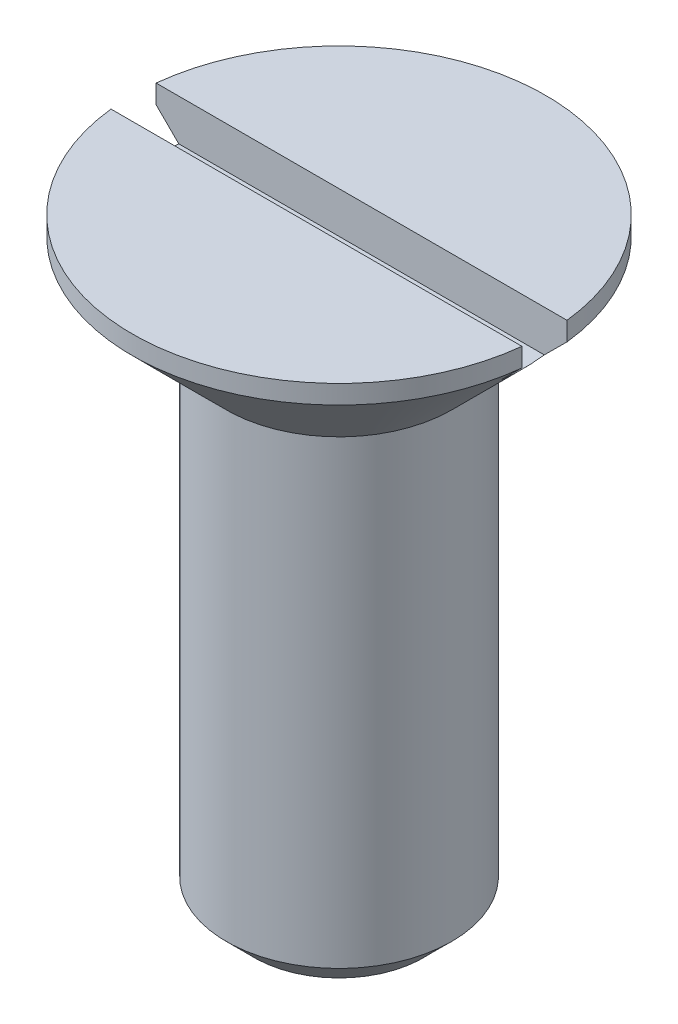
ISO-10303-21;
HEADER;
FILE_DESCRIPTION(('STEP AP214'),'2;1');
FILE_NAME('part.step','',(''),(''),'','','');
FILE_SCHEMA(('AUTOMOTIVE_DESIGN { 1 0 10303 214 1 1 1 1 }'));
ENDSEC;
DATA;
#1=APPLICATION_CONTEXT('core data for automotive mechanical design processes');
#2=APPLICATION_PROTOCOL_DEFINITION('international standard','automotive_design',2000,#1);
#3=PRODUCT_CONTEXT('',#1,'mechanical');
#4=PRODUCT('Part','Part','',(#3));
#5=PRODUCT_RELATED_PRODUCT_CATEGORY('part','',(#4));
#6=PRODUCT_DEFINITION_FORMATION('','',#4);
#7=PRODUCT_DEFINITION_CONTEXT('part definition',#1,'design');
#8=PRODUCT_DEFINITION('design','',#6,#7);
#9=PRODUCT_DEFINITION_SHAPE('','',#8);
#10=(LENGTH_UNIT() NAMED_UNIT(*) SI_UNIT(.MILLI.,.METRE.));
#11=(NAMED_UNIT(*) PLANE_ANGLE_UNIT() SI_UNIT($,.RADIAN.));
#12=(NAMED_UNIT(*) SI_UNIT($,.STERADIAN.) SOLID_ANGLE_UNIT());
#13=UNCERTAINTY_MEASURE_WITH_UNIT(LENGTH_MEASURE(1.E-05),#10,'distance_accuracy_value','');
#14=(GEOMETRIC_REPRESENTATION_CONTEXT(3) GLOBAL_UNCERTAINTY_ASSIGNED_CONTEXT((#13)) GLOBAL_UNIT_ASSIGNED_CONTEXT((#10,
#11,#12)) REPRESENTATION_CONTEXT('',''));
#15=CARTESIAN_POINT('',(0.,0.,0.));
#16=DIRECTION('',(0.,0.,1.));
#17=DIRECTION('',(1.,0.,0.));
#18=AXIS2_PLACEMENT_3D('',#15,#16,#17);
#19=CARTESIAN_POINT('',(0.,125.763182897862,0.));
#20=DIRECTION('',(0.,1.,0.));
#21=DIRECTION('',(-1.,0.,0.));
#22=AXIS2_PLACEMENT_3D('',#19,#20,#21);
#23=CYLINDRICAL_SURFACE('',#22,5.50000000000001);
#24=CARTESIAN_POINT('',(0.,15.5,0.));
#25=DIRECTION('',(0.,1.,0.));
#26=DIRECTION('',(-1.,0.,0.));
#27=AXIS2_PLACEMENT_3D('',#24,#25,#26);
#28=CIRCLE('',#27,5.50000000000001);
#29=CARTESIAN_POINT('',(5.46717477313467,15.5,-0.600000000000001));
#30=VERTEX_POINT('',#29);
#31=CARTESIAN_POINT('',(-5.46717477313467,15.5,-0.599999999999999));
#32=VERTEX_POINT('',#31);
#33=EDGE_CURVE('E101',#30,#32,#28,.T.);
#34=ORIENTED_EDGE('',*,*,#33,.T.);
#35=DIRECTION('',(0.,1.,0.));
#36=VECTOR('',#35,1.);
#37=CARTESIAN_POINT('',(-5.46717477313468,125.763182897862,-0.599999999999999));
#38=LINE('',#37,#36);
#39=CARTESIAN_POINT('',(-5.46717477313467,16.,-0.599999999999999));
#40=VERTEX_POINT('',#39);
#41=EDGE_CURVE('E52',#32,#40,#38,.T.);
#42=ORIENTED_EDGE('',*,*,#41,.T.);
#43=CARTESIAN_POINT('',(0.,16.,0.));
#44=DIRECTION('',(0.,1.,0.));
#45=DIRECTION('',(-1.,0.,0.));
#46=AXIS2_PLACEMENT_3D('',#43,#44,#45);
#47=CIRCLE('',#46,5.50000000000001);
#48=CARTESIAN_POINT('',(5.46717477313467,16.,-0.600000000000001));
#49=VERTEX_POINT('',#48);
#50=EDGE_CURVE('E102',#49,#40,#47,.T.);
#51=ORIENTED_EDGE('',*,*,#50,.F.);
#52=DIRECTION('',(0.,1.,0.));
#53=VECTOR('',#52,1.);
#54=CARTESIAN_POINT('',(5.46717477313466,125.763182897862,-0.600000000000001));
#55=LINE('',#54,#53);
#56=EDGE_CURVE('E138',#49,#30,#55,.F.);
#57=ORIENTED_EDGE('',*,*,#56,.T.);
#58=EDGE_LOOP('',(#34,#42,#51,#57));
#59=FACE_BOUND('',#58,.T.);
#60=ADVANCED_FACE('F29',(#59),#23,.T.);
#61=CARTESIAN_POINT('',(0.,16.,0.));
#62=DIRECTION('',(0.,-1.,0.));
#63=DIRECTION('',(1.,0.,0.));
#64=AXIS2_PLACEMENT_3D('',#61,#62,#63);
#65=PLANE('',#64);
#66=ORIENTED_EDGE('',*,*,#50,.T.);
#67=DIRECTION('',(1.,0.,0.));
#68=VECTOR('',#67,1.);
#69=CARTESIAN_POINT('',(0.,16.,-0.6));
#70=LINE('',#69,#68);
#71=EDGE_CURVE('E88',#40,#49,#70,.T.);
#72=ORIENTED_EDGE('',*,*,#71,.T.);
#73=EDGE_LOOP('',(#66,#72));
#74=FACE_BOUND('',#73,.T.);
#75=ADVANCED_FACE('F149',(#74),#65,.F.);
#76=CARTESIAN_POINT('',(3.,0.,0.));
#77=DIRECTION('',(0.,1.,0.));
#78=DIRECTION('',(-1.,0.,0.));
#79=AXIS2_PLACEMENT_3D('',#76,#77,#78);
#80=PLANE('',#79);
#81=CARTESIAN_POINT('',(0.,0.,0.));
#82=DIRECTION('',(0.,1.,0.));
#83=DIRECTION('',(-1.,0.,0.));
#84=AXIS2_PLACEMENT_3D('',#81,#82,#83);
#85=CIRCLE('',#84,2.25000000000001);
#86=CARTESIAN_POINT('',(-2.25000000000001,0.,0.));
#87=VERTEX_POINT('',#86);
#88=EDGE_CURVE('E11',#87,#87,#85,.F.);
#89=ORIENTED_EDGE('',*,*,#88,.T.);
#90=EDGE_LOOP('',(#89));
#91=FACE_BOUND('',#90,.T.);
#92=ADVANCED_FACE('F31',(#91),#80,.F.);
#93=CARTESIAN_POINT('',(0.,125.763182897862,0.));
#94=DIRECTION('',(0.,1.,0.));
#95=DIRECTION('',(-1.,0.,0.));
#96=AXIS2_PLACEMENT_3D('',#93,#94,#95);
#97=CYLINDRICAL_SURFACE('',#96,3.);
#98=CARTESIAN_POINT('',(0.,0.750000000000001,0.));
#99=DIRECTION('',(0.,1.,0.));
#100=DIRECTION('',(-1.,0.,0.));
#101=AXIS2_PLACEMENT_3D('',#98,#99,#100);
#102=CIRCLE('',#101,3.);
#103=CARTESIAN_POINT('',(-3.,0.75,0.));
#104=VERTEX_POINT('',#103);
#105=EDGE_CURVE('E37',#104,#104,#102,.T.);
#106=ORIENTED_EDGE('',*,*,#105,.T.);
#107=EDGE_LOOP('',(#106));
#108=FACE_BOUND('',#107,.T.);
#109=CARTESIAN_POINT('',(0.,13.,0.));
#110=DIRECTION('',(0.,1.,0.));
#111=DIRECTION('',(-1.,0.,0.));
#112=AXIS2_PLACEMENT_3D('',#109,#110,#111);
#113=CIRCLE('',#112,3.);
#114=CARTESIAN_POINT('',(-3.,13.,0.));
#115=VERTEX_POINT('',#114);
#116=EDGE_CURVE('E89',#115,#115,#113,.T.);
#117=ORIENTED_EDGE('',*,*,#116,.F.);
#118=EDGE_LOOP('',(#117));
#119=FACE_BOUND('',#118,.T.);
#120=ADVANCED_FACE('F157',(#108,#119),#97,.T.);
#121=CARTESIAN_POINT('',(0.,13.,0.));
#122=DIRECTION('',(0.,1.,0.));
#123=DIRECTION('',(-1.,0.,0.));
#124=AXIS2_PLACEMENT_3D('',#121,#122,#123);
#125=CONICAL_SURFACE('',#124,3.,0.785398163397448);
#126=ORIENTED_EDGE('',*,*,#33,.F.);
#127=CARTESIAN_POINT('',(12.0951380212487,22.1100108898818,-0.600000000000001));
#128=CARTESIAN_POINT('',(11.6796656036397,21.6950528945452,-0.600000000000001));
#129=CARTESIAN_POINT('',(11.2641708389118,21.2801172624036,-0.600000000000001));
#130=CARTESIAN_POINT('',(10.4331049381274,20.4503170669954,-0.600000000000001));
#131=CARTESIAN_POINT('',(10.0175338015904,20.03545250421,-0.600000000000001));
#132=CARTESIAN_POINT('',(9.18622716868447,19.2057645935921,-0.600000000000001));
#133=CARTESIAN_POINT('',(8.77049165707137,18.7909412610329,-0.600000000000001));
#134=CARTESIAN_POINT('',(7.93886813876427,17.9614527406175,-0.600000000000001));
#135=CARTESIAN_POINT('',(7.52298013305639,17.5467875517728,-0.600000000000001));
#136=CARTESIAN_POINT('',(6.68541750208731,16.7121942917957,-0.600000000000001));
#137=CARTESIAN_POINT('',(6.26373950689477,16.2922696025233,-0.600000000000001));
#138=CARTESIAN_POINT('',(5.41992863983436,15.4528613612213,-0.600000000000001));
#139=CARTESIAN_POINT('',(4.99779575961436,15.0333778175809,-0.600000000000001));
#140=CARTESIAN_POINT('',(4.36391156708249,14.404882697502,-0.600000000000001));
#141=CARTESIAN_POINT('',(4.15251265775567,14.1955158613069,-0.600000000000001));
#142=CARTESIAN_POINT('',(3.72933777965307,13.777160371771,-0.600000000000001));
#143=CARTESIAN_POINT('',(3.51756180804973,13.5681717212902,-0.6));
#144=CARTESIAN_POINT('',(3.09340508148398,13.1508224904441,-0.6));
#145=CARTESIAN_POINT('',(2.88102434773797,12.9424618885608,-0.6));
#146=CARTESIAN_POINT('',(2.56158400503628,12.6308141336848,-0.6));
#147=CARTESIAN_POINT('',(2.45495967057634,12.5270810371465,-0.6));
#148=CARTESIAN_POINT('',(2.24128558495607,12.3200541476939,-0.6));
#149=CARTESIAN_POINT('',(2.1342358356952,12.2167603528224,-0.6));
#150=CARTESIAN_POINT('',(1.96851539962987,12.0578586549902,-0.6));
#151=CARTESIAN_POINT('',(1.91007314716257,12.0020126221314,-0.6));
#152=CARTESIAN_POINT('',(1.79293848959893,11.8905822939596,-0.6));
#153=CARTESIAN_POINT('',(1.7342460821823,11.8349980010845,-0.6));
#154=CARTESIAN_POINT('',(1.61660382106689,11.7242427997175,-0.6));
#155=CARTESIAN_POINT('',(1.55765435798411,11.6690714772047,-0.6));
#156=CARTESIAN_POINT('',(1.43931126086082,11.5592102515148,-0.6));
#157=CARTESIAN_POINT('',(1.37991763630936,11.504520338107,-0.6));
#158=CARTESIAN_POINT('',(1.2402740725849,11.3773752483312,-0.6));
#159=CARTESIAN_POINT('',(1.15978115908662,11.3051844001292,-0.6));
#160=CARTESIAN_POINT('',(1.03756703794511,11.198399202588,-0.6));
#161=CARTESIAN_POINT('',(0.996536617009663,11.1630156922861,-0.6));
#162=CARTESIAN_POINT('',(0.913852032905214,11.0929951221089,-0.6));
#163=CARTESIAN_POINT('',(0.872197969786393,11.0583579446298,-0.6));
#164=CARTESIAN_POINT('',(0.791299366014583,10.9927928827436,-0.6));
#165=CARTESIAN_POINT('',(0.752119188587603,10.9617859443906,-0.6));
#166=CARTESIAN_POINT('',(0.672759138642568,10.9010823402667,-0.6));
#167=CARTESIAN_POINT('',(0.632579454007325,10.87138543111,-0.6));
#168=CARTESIAN_POINT('',(0.550880301272813,10.8140157080452,-0.6));
#169=CARTESIAN_POINT('',(0.509363076052934,10.7863397363835,-0.6));
#170=CARTESIAN_POINT('',(0.424405599335266,10.7341614805984,-0.6));
#171=CARTESIAN_POINT('',(0.38096821331291,10.709654668264,-0.6));
#172=CARTESIAN_POINT('',(0.297919800401261,10.6690608246886,-0.6));
#173=CARTESIAN_POINT('',(0.258664197958348,10.6522686373426,-0.6));
#174=CARTESIAN_POINT('',(0.178131204845774,10.6247552741389,-0.6));
#175=CARTESIAN_POINT('',(0.136863011252723,10.6140088632231,-0.6));
#176=CARTESIAN_POINT('',(0.0597827189723831,10.6019770199271,-0.6));
#177=CARTESIAN_POINT('',(0.0241765819837964,10.5994358265959,-0.6));
#178=CARTESIAN_POINT('',(-0.046898083766453,10.600779265303,-0.6));
#179=CARTESIAN_POINT('',(-0.0823666288549613,10.6046631100088,-0.6));
#180=CARTESIAN_POINT('',(-0.164228481301677,10.6203530264431,-0.6));
#181=CARTESIAN_POINT('',(-0.210171059017372,10.6344292676086,-0.6));
#182=CARTESIAN_POINT('',(-0.277090527383117,10.6605677965075,-0.6));
#183=CARTESIAN_POINT('',(-0.299133519081195,10.6701577562829,-0.6));
#184=CARTESIAN_POINT('',(-0.342597478729003,10.6906576871152,-0.6));
#185=CARTESIAN_POINT('',(-0.364018609177626,10.7015673094096,-0.6));
#186=CARTESIAN_POINT('',(-0.423927415438586,10.7339230841824,-0.6));
#187=CARTESIAN_POINT('',(-0.461758475752064,10.7565723407774,-0.6));
#188=CARTESIAN_POINT('',(-0.53603057037088,10.8040631010141,-0.6));
#189=CARTESIAN_POINT('',(-0.572470391053746,10.828906458761,-0.6));
#190=CARTESIAN_POINT('',(-0.644393056714326,10.8801156734928,-0.6));
#191=CARTESIAN_POINT('',(-0.679873295058422,10.9064851648073,-0.6));
#192=CARTESIAN_POINT('',(-0.75005310246509,10.9602471413157,-0.6));
#193=CARTESIAN_POINT('',(-0.784752544554439,10.9876397909965,-0.6));
#194=CARTESIAN_POINT('',(-0.888330721356525,11.071186655234,-0.6));
#195=CARTESIAN_POINT('',(-0.956321530602342,11.1284378481806,-0.6));
#196=CARTESIAN_POINT('',(-1.09077613082546,11.2444525317654,-0.6));
#197=CARTESIAN_POINT('',(-1.15724235396904,11.3032132428359,-0.6));
#198=CARTESIAN_POINT('',(-1.28834061338827,11.4209152201069,-0.6));
#199=CARTESIAN_POINT('',(-1.35298530053584,11.479842417436,-0.6));
#200=CARTESIAN_POINT('',(-1.48167129148732,11.5983515326856,-0.6));
#201=CARTESIAN_POINT('',(-1.54571258660467,11.6579334600051,-0.6));
#202=CARTESIAN_POINT('',(-1.73721596411775,11.8373626718181,-0.6));
#203=CARTESIAN_POINT('',(-1.86404642355578,11.957883261701,-0.6));
#204=CARTESIAN_POINT('',(-2.11689245962201,12.1999857175184,-0.6));
#205=CARTESIAN_POINT('',(-2.24290725197344,12.3215683984543,-0.6));
#206=CARTESIAN_POINT('',(-2.49435723427002,12.5653196514299,-0.6));
#207=CARTESIAN_POINT('',(-2.61979245120197,12.687488195639,-0.6));
#208=CARTESIAN_POINT('',(-2.86947718902347,12.9314157091041,-0.6));
#209=CARTESIAN_POINT('',(-2.99372912768727,13.0531722066079,-0.6));
#210=CARTESIAN_POINT('',(-3.24197726622127,13.2969485978384,-0.6));
#211=CARTESIAN_POINT('',(-3.36597346293398,13.4189684947796,-0.6));
#212=CARTESIAN_POINT('',(-3.73760673191002,13.7852242071569,-0.6));
#213=CARTESIAN_POINT('',(-3.98497092490543,14.0297368100387,-0.6));
#214=CARTESIAN_POINT('',(-4.55885990168439,14.5979470007114,-0.599999999999999));
#215=CARTESIAN_POINT('',(-4.88523369425349,14.9217969537338,-0.599999999999999));
#216=CARTESIAN_POINT('',(-5.53759663246641,15.569885085845,-0.599999999999999));
#217=CARTESIAN_POINT('',(-5.86358577739625,15.8941232656521,-0.599999999999999));
#218=CARTESIAN_POINT('',(-6.84130493557784,16.8672705889861,-0.599999999999999));
#219=CARTESIAN_POINT('',(-7.49269483465289,17.516521363431,-0.599999999999999));
#220=CARTESIAN_POINT('',(-8.80276843924291,18.8230663112804,-0.599999999999999));
#221=CARTESIAN_POINT('',(-9.46144758146022,19.4803650575615,-0.599999999999999));
#222=CARTESIAN_POINT('',(-10.7784760394379,20.7951006116141,-0.599999999999999));
#223=CARTESIAN_POINT('',(-11.4368253893187,21.4525373852028,-0.599999999999999));
#224=CARTESIAN_POINT('',(-12.0951380212487,22.1100108898818,-0.599999999999999));
#225=B_SPLINE_CURVE_WITH_KNOTS('',3,(#127,#128,#129,#130,#131,#132,#133,#134,#135,#136,#137,
#138,#139,#140,#141,#142,#143,#144,#145,#146,#147,#148,#149,#150,#151,#152,#153,#154,#155,#156,
#157,#158,#159,#160,#161,#162,#163,#164,#165,#166,#167,#168,#169,#170,#171,#172,#173,#174,#175,
#176,#177,#178,#179,#180,#181,#182,#183,#184,#185,#186,#187,#188,#189,#190,#191,#192,#193,#194,
#195,#196,#197,#198,#199,#200,#201,#202,#203,#204,#205,#206,#207,#208,#209,#210,#211,#212,#213,
#214,#215,#216,#217,#218,#219,#220,#221,#222,#223,#224),.UNSPECIFIED.,.F.,.F.,(4,2,2,2,2,2,2,2,
2,2,2,2,2,2,2,2,2,2,2,2,2,2,2,2,2,2,2,2,2,2,2,2,2,2,2,2,2,2,2,2,2,2,2,2,2,2,2,2,4),(0.,
1.76160927905883,3.52323004831131,5.28511246320157,7.04698367880767,8.83229635368213,
10.6176423870645,11.5102313775106,12.402827089796,13.2953918644129,13.7416688038841,
14.1879437529796,14.4304477398364,14.6729539809372,14.9151709434148,15.1573827458842,
15.4817260735393,15.6442607048621,15.8067695345603,15.956647211626,16.1064969251415,
16.2561072500143,16.4055013869819,16.5332849812819,16.660531172842,16.7670545380187,
16.8735648506512,17.0168065075244,17.0889012703616,17.1609770213314,17.2931273119173,
17.4253903634111,17.5579824981959,17.6905960415438,17.9571939667025,18.2233319331035,
18.4857404711835,18.7481527811991,19.2730225012346,19.7983383561433,20.3236294991336,
20.8455185947241,21.3674140956368,22.4108588649775,23.7902015875583,25.1695468664321,
27.9286256080476,30.7202377901634,33.511442272455),.UNSPECIFIED.);
#226=CARTESIAN_POINT('',(4.86312656631513,14.9,-0.600000000000001));
#227=VERTEX_POINT('',#226);
#228=EDGE_CURVE('E132',#30,#227,#225,.T.);
#229=ORIENTED_EDGE('',*,*,#228,.T.);
#230=CARTESIAN_POINT('',(0.,14.9,0.));
#231=DIRECTION('',(0.,1.,0.));
#232=DIRECTION('',(0.,0.,1.));
#233=AXIS2_PLACEMENT_3D('',#230,#231,#232);
#234=CIRCLE('',#233,4.9);
#235=CARTESIAN_POINT('',(4.86312656631513,14.9,0.599999999999999));
#236=VERTEX_POINT('',#235);
#237=EDGE_CURVE('E116',#236,#227,#234,.T.);
#238=ORIENTED_EDGE('',*,*,#237,.F.);
#239=CARTESIAN_POINT('',(-12.0951380212487,22.1100108898818,0.600000000000001));
#240=CARTESIAN_POINT('',(-11.6796656036397,21.6950528945452,0.600000000000001));
#241=CARTESIAN_POINT('',(-11.2641708389118,21.2801172624036,0.600000000000001));
#242=CARTESIAN_POINT('',(-10.4331049381274,20.4503170669954,0.600000000000001));
#243=CARTESIAN_POINT('',(-10.0175338015904,20.03545250421,0.600000000000001));
#244=CARTESIAN_POINT('',(-9.18622716868448,19.2057645935921,0.600000000000001));
#245=CARTESIAN_POINT('',(-8.77049165707138,18.7909412610329,0.600000000000001));
#246=CARTESIAN_POINT('',(-7.93886813876428,17.9614527406175,0.600000000000001));
#247=CARTESIAN_POINT('',(-7.5229801330564,17.5467875517728,0.600000000000001));
#248=CARTESIAN_POINT('',(-6.68541750208732,16.7121942917957,0.600000000000001));
#249=CARTESIAN_POINT('',(-6.26373950689477,16.2922696025233,0.600000000000001));
#250=CARTESIAN_POINT('',(-5.41992863983436,15.4528613612213,0.600000000000001));
#251=CARTESIAN_POINT('',(-4.99779575961437,15.0333778175809,0.6));
#252=CARTESIAN_POINT('',(-4.36391156708249,14.404882697502,0.6));
#253=CARTESIAN_POINT('',(-4.15251265775568,14.1955158613069,0.6));
#254=CARTESIAN_POINT('',(-3.72933777965307,13.777160371771,0.6));
#255=CARTESIAN_POINT('',(-3.51756180804974,13.5681717212902,0.6));
#256=CARTESIAN_POINT('',(-3.09340508148398,13.1508224904441,0.6));
#257=CARTESIAN_POINT('',(-2.88102434773797,12.9424618885608,0.6));
#258=CARTESIAN_POINT('',(-2.56158400503628,12.6308141336848,0.6));
#259=CARTESIAN_POINT('',(-2.45495967057634,12.5270810371465,0.6));
#260=CARTESIAN_POINT('',(-2.24128558495607,12.3200541476939,0.6));
#261=CARTESIAN_POINT('',(-2.1342358356952,12.2167603528224,0.6));
#262=CARTESIAN_POINT('',(-1.96851539962987,12.0578586549902,0.6));
#263=CARTESIAN_POINT('',(-1.91007314716257,12.0020126221314,0.6));
#264=CARTESIAN_POINT('',(-1.79293848959893,11.8905822939596,0.6));
#265=CARTESIAN_POINT('',(-1.7342460821823,11.8349980010845,0.6));
#266=CARTESIAN_POINT('',(-1.61660382106689,11.7242427997175,0.6));
#267=CARTESIAN_POINT('',(-1.55765435798411,11.6690714772047,0.6));
#268=CARTESIAN_POINT('',(-1.43931126086082,11.5592102515148,0.6));
#269=CARTESIAN_POINT('',(-1.37991763630936,11.504520338107,0.6));
#270=CARTESIAN_POINT('',(-1.2402740725849,11.3773752483312,0.6));
#271=CARTESIAN_POINT('',(-1.15978115908662,11.3051844001292,0.6));
#272=CARTESIAN_POINT('',(-1.03756703794511,11.198399202588,0.6));
#273=CARTESIAN_POINT('',(-0.996536617009666,11.1630156922861,0.6));
#274=CARTESIAN_POINT('',(-0.913852032905218,11.0929951221089,0.6));
#275=CARTESIAN_POINT('',(-0.872197969786395,11.0583579446298,0.6));
#276=CARTESIAN_POINT('',(-0.791299366014585,10.9927928827436,0.6));
#277=CARTESIAN_POINT('',(-0.752119188587605,10.9617859443906,0.6));
#278=CARTESIAN_POINT('',(-0.67275913864257,10.9010823402667,0.6));
#279=CARTESIAN_POINT('',(-0.632579454007327,10.87138543111,0.6));
#280=CARTESIAN_POINT('',(-0.550880301272814,10.8140157080452,0.6));
#281=CARTESIAN_POINT('',(-0.509363076052935,10.7863397363835,0.6));
#282=CARTESIAN_POINT('',(-0.424405599335266,10.7341614805984,0.6));
#283=CARTESIAN_POINT('',(-0.380968213312911,10.709654668264,0.6));
#284=CARTESIAN_POINT('',(-0.297919800401262,10.6690608246886,0.6));
#285=CARTESIAN_POINT('',(-0.258664197958349,10.6522686373426,0.6));
#286=CARTESIAN_POINT('',(-0.178131204845775,10.6247552741389,0.6));
#287=CARTESIAN_POINT('',(-0.136863011252724,10.6140088632231,0.6));
#288=CARTESIAN_POINT('',(-0.0597827189723853,10.6019770199271,0.6));
#289=CARTESIAN_POINT('',(-0.0241765819837998,10.5994358265959,0.6));
#290=CARTESIAN_POINT('',(0.0468980837664497,10.600779265303,0.6));
#291=CARTESIAN_POINT('',(0.082366628854959,10.6046631100088,0.6));
#292=CARTESIAN_POINT('',(0.164228481301674,10.6203530264431,0.6));
#293=CARTESIAN_POINT('',(0.210171059017368,10.6344292676086,0.6));
#294=CARTESIAN_POINT('',(0.277090527383113,10.6605677965075,0.6));
#295=CARTESIAN_POINT('',(0.299133519081193,10.6701577562829,0.6));
#296=CARTESIAN_POINT('',(0.342597478729002,10.6906576871152,0.6));
#297=CARTESIAN_POINT('',(0.364018609177625,10.7015673094096,0.6));
#298=CARTESIAN_POINT('',(0.423927415438586,10.7339230841824,0.6));
#299=CARTESIAN_POINT('',(0.461758475752065,10.7565723407774,0.6));
#300=CARTESIAN_POINT('',(0.53603057037088,10.8040631010141,0.6));
#301=CARTESIAN_POINT('',(0.572470391053745,10.828906458761,0.6));
#302=CARTESIAN_POINT('',(0.644393056714325,10.8801156734928,0.6));
#303=CARTESIAN_POINT('',(0.679873295058423,10.9064851648073,0.6));
#304=CARTESIAN_POINT('',(0.750053102465092,10.9602471413157,0.6));
#305=CARTESIAN_POINT('',(0.78475254455444,10.9876397909965,0.6));
#306=CARTESIAN_POINT('',(0.888330721356525,11.071186655234,0.6));
#307=CARTESIAN_POINT('',(0.956321530602342,11.1284378481806,0.6));
#308=CARTESIAN_POINT('',(1.09077613082546,11.2444525317654,0.6));
#309=CARTESIAN_POINT('',(1.15724235396905,11.3032132428359,0.6));
#310=CARTESIAN_POINT('',(1.28834061338827,11.4209152201069,0.6));
#311=CARTESIAN_POINT('',(1.35298530053584,11.479842417436,0.6));
#312=CARTESIAN_POINT('',(1.48167129148732,11.5983515326856,0.6));
#313=CARTESIAN_POINT('',(1.54571258660468,11.6579334600051,0.6));
#314=CARTESIAN_POINT('',(1.73721596411775,11.8373626718181,0.6));
#315=CARTESIAN_POINT('',(1.86404642355578,11.957883261701,0.6));
#316=CARTESIAN_POINT('',(2.11689245962201,12.1999857175184,0.6));
#317=CARTESIAN_POINT('',(2.24290725197344,12.3215683984543,0.6));
#318=CARTESIAN_POINT('',(2.49435723427002,12.5653196514299,0.6));
#319=CARTESIAN_POINT('',(2.61979245120198,12.687488195639,0.6));
#320=CARTESIAN_POINT('',(2.86947718902347,12.9314157091041,0.6));
#321=CARTESIAN_POINT('',(2.99372912768728,13.0531722066079,0.6));
#322=CARTESIAN_POINT('',(3.24197726622128,13.2969485978384,0.6));
#323=CARTESIAN_POINT('',(3.36597346293399,13.4189684947796,0.6));
#324=CARTESIAN_POINT('',(3.73760673191003,13.7852242071569,0.6));
#325=CARTESIAN_POINT('',(3.98497092490544,14.0297368100387,0.599999999999999));
#326=CARTESIAN_POINT('',(4.5588599016844,14.5979470007114,0.599999999999999));
#327=CARTESIAN_POINT('',(4.8852336942535,14.9217969537339,0.599999999999999));
#328=CARTESIAN_POINT('',(5.53759663246642,15.569885085845,0.599999999999999));
#329=CARTESIAN_POINT('',(5.86358577739626,15.8941232656522,0.599999999999999));
#330=CARTESIAN_POINT('',(6.84130493557784,16.8672705889861,0.599999999999999));
#331=CARTESIAN_POINT('',(7.49269483465289,17.516521363431,0.599999999999999));
#332=CARTESIAN_POINT('',(8.80276843924291,18.8230663112804,0.599999999999999));
#333=CARTESIAN_POINT('',(9.46144758146023,19.4803650575615,0.599999999999999));
#334=CARTESIAN_POINT('',(10.7784760394379,20.7951006116141,0.599999999999999));
#335=CARTESIAN_POINT('',(11.4368253893187,21.4525373852028,0.599999999999999));
#336=CARTESIAN_POINT('',(12.0951380212487,22.1100108898818,0.599999999999998));
#337=B_SPLINE_CURVE_WITH_KNOTS('',3,(#239,#240,#241,#242,#243,#244,#245,#246,#247,#248,#249,
#250,#251,#252,#253,#254,#255,#256,#257,#258,#259,#260,#261,#262,#263,#264,#265,#266,#267,#268,
#269,#270,#271,#272,#273,#274,#275,#276,#277,#278,#279,#280,#281,#282,#283,#284,#285,#286,#287,
#288,#289,#290,#291,#292,#293,#294,#295,#296,#297,#298,#299,#300,#301,#302,#303,#304,#305,#306,
#307,#308,#309,#310,#311,#312,#313,#314,#315,#316,#317,#318,#319,#320,#321,#322,#323,#324,#325,
#326,#327,#328,#329,#330,#331,#332,#333,#334,#335,#336),.UNSPECIFIED.,.F.,.F.,(4,2,2,2,2,2,2,2,
2,2,2,2,2,2,2,2,2,2,2,2,2,2,2,2,2,2,2,2,2,2,2,2,2,2,2,2,2,2,2,2,2,2,2,2,2,2,2,2,4),(0.,
1.76160927905883,3.52323004831131,5.28511246320157,7.04698367880767,8.83229635368213,
10.6176423870645,11.5102313775106,12.402827089796,13.2953918644129,13.7416688038841,
14.1879437529796,14.4304477398364,14.6729539809372,14.9151709434148,15.1573827458843,
15.4817260735393,15.6442607048621,15.8067695345603,15.956647211626,16.1064969251415,
16.2561072500143,16.4055013869819,16.5332849812819,16.660531172842,16.7670545380187,
16.8735648506512,17.0168065075244,17.0889012703616,17.1609770213314,17.2931273119173,
17.4253903634111,17.557982498196,17.6905960415438,17.9571939667025,18.2233319331035,
18.4857404711835,18.7481527811991,19.2730225012346,19.7983383561433,20.3236294991336,
20.8455185947242,21.3674140956368,22.4108588649775,23.7902015875584,25.1695468664322,
27.9286256080476,30.7202377901635,33.511442272455),.UNSPECIFIED.);
#338=CARTESIAN_POINT('',(5.46717477313467,15.5,0.599999999999999));
#339=VERTEX_POINT('',#338);
#340=EDGE_CURVE('E97',#236,#339,#337,.T.);
#341=ORIENTED_EDGE('',*,*,#340,.T.);
#342=CARTESIAN_POINT('',(-5.46717477313467,15.5,0.600000000000001));
#343=VERTEX_POINT('',#342);
#344=EDGE_CURVE('E96',#343,#339,#28,.T.);
#345=ORIENTED_EDGE('',*,*,#344,.F.);
#346=CARTESIAN_POINT('',(-4.86312656631513,14.9,0.600000000000001));
#347=VERTEX_POINT('',#346);
#348=EDGE_CURVE('E98',#343,#347,#337,.T.);
#349=ORIENTED_EDGE('',*,*,#348,.T.);
#350=CARTESIAN_POINT('',(-4.86312656631513,14.9,-0.599999999999999));
#351=VERTEX_POINT('',#350);
#352=EDGE_CURVE('E115',#351,#347,#234,.T.);
#353=ORIENTED_EDGE('',*,*,#352,.F.);
#354=EDGE_CURVE('E107',#351,#32,#225,.T.);
#355=ORIENTED_EDGE('',*,*,#354,.T.);
#356=EDGE_LOOP('',(#126,#229,#238,#341,#345,#349,#353,#355));
#357=FACE_BOUND('',#356,.T.);
#358=ORIENTED_EDGE('',*,*,#116,.T.);
#359=EDGE_LOOP('',(#358));
#360=FACE_BOUND('',#359,.T.);
#361=ADVANCED_FACE('F136',(#357,#360),#125,.T.);
#362=ORIENTED_EDGE('',*,*,#344,.T.);
#363=DIRECTION('',(0.,1.,0.));
#364=VECTOR('',#363,1.);
#365=CARTESIAN_POINT('',(5.46717477313466,125.763182897862,0.599999999999999));
#366=LINE('',#365,#364);
#367=CARTESIAN_POINT('',(5.46717477313467,16.,0.599999999999999));
#368=VERTEX_POINT('',#367);
#369=EDGE_CURVE('E83',#339,#368,#366,.T.);
#370=ORIENTED_EDGE('',*,*,#369,.T.);
#371=CARTESIAN_POINT('',(-5.46717477313467,16.,0.600000000000001));
#372=VERTEX_POINT('',#371);
#373=EDGE_CURVE('E94',#372,#368,#47,.T.);
#374=ORIENTED_EDGE('',*,*,#373,.F.);
#375=DIRECTION('',(0.,1.,0.));
#376=VECTOR('',#375,1.);
#377=CARTESIAN_POINT('',(-5.46717477313468,125.763182897862,0.600000000000001));
#378=LINE('',#377,#376);
#379=EDGE_CURVE('E44',#372,#343,#378,.F.);
#380=ORIENTED_EDGE('',*,*,#379,.T.);
#381=EDGE_LOOP('',(#362,#370,#374,#380));
#382=FACE_BOUND('',#381,.T.);
#383=ADVANCED_FACE('F93',(#382),#23,.T.);
#384=ORIENTED_EDGE('',*,*,#373,.T.);
#385=DIRECTION('',(-1.,0.,0.));
#386=VECTOR('',#385,1.);
#387=CARTESIAN_POINT('',(0.,16.,0.6));
#388=LINE('',#387,#386);
#389=EDGE_CURVE('E79',#368,#372,#388,.T.);
#390=ORIENTED_EDGE('',*,*,#389,.T.);
#391=EDGE_LOOP('',(#384,#390));
#392=FACE_BOUND('',#391,.T.);
#393=ADVANCED_FACE('F100',(#392),#65,.F.);
#394=CARTESIAN_POINT('',(-6.,14.9,0.600000000000001));
#395=DIRECTION('',(0.,1.,0.));
#396=DIRECTION('',(0.,0.,1.));
#397=AXIS2_PLACEMENT_3D('',#394,#395,#396);
#398=PLANE('',#397);
#399=ORIENTED_EDGE('',*,*,#237,.T.);
#400=DIRECTION('',(-1.,0.,0.));
#401=VECTOR('',#400,1.);
#402=CARTESIAN_POINT('',(-6.,14.9,-0.599999999999999));
#403=LINE('',#402,#401);
#404=EDGE_CURVE('E126',#227,#351,#403,.T.);
#405=ORIENTED_EDGE('',*,*,#404,.T.);
#406=ORIENTED_EDGE('',*,*,#352,.T.);
#407=DIRECTION('',(1.,0.,0.));
#408=VECTOR('',#407,1.);
#409=CARTESIAN_POINT('',(-6.,14.9,0.600000000000001));
#410=LINE('',#409,#408);
#411=EDGE_CURVE('E128',#347,#236,#410,.T.);
#412=ORIENTED_EDGE('',*,*,#411,.T.);
#413=EDGE_LOOP('',(#399,#405,#406,#412));
#414=FACE_BOUND('',#413,.T.);
#415=ADVANCED_FACE('F125',(#414),#398,.T.);
#416=CARTESIAN_POINT('',(-6.,14.9,-0.599999999999999));
#417=DIRECTION('',(0.,0.,-1.));
#418=DIRECTION('',(-1.,0.,0.));
#419=AXIS2_PLACEMENT_3D('',#416,#417,#418);
#420=PLANE('',#419);
#421=ORIENTED_EDGE('',*,*,#404,.F.);
#422=ORIENTED_EDGE('',*,*,#228,.F.);
#423=ORIENTED_EDGE('',*,*,#56,.F.);
#424=ORIENTED_EDGE('',*,*,#71,.F.);
#425=ORIENTED_EDGE('',*,*,#41,.F.);
#426=ORIENTED_EDGE('',*,*,#354,.F.);
#427=EDGE_LOOP('',(#421,#422,#423,#424,#425,#426));
#428=FACE_BOUND('',#427,.T.);
#429=ADVANCED_FACE('F131',(#428),#420,.F.);
#430=CARTESIAN_POINT('',(-6.,14.9,0.600000000000001));
#431=DIRECTION('',(0.,0.,1.));
#432=DIRECTION('',(1.,0.,0.));
#433=AXIS2_PLACEMENT_3D('',#430,#431,#432);
#434=PLANE('',#433);
#435=ORIENTED_EDGE('',*,*,#411,.F.);
#436=ORIENTED_EDGE('',*,*,#348,.F.);
#437=ORIENTED_EDGE('',*,*,#379,.F.);
#438=ORIENTED_EDGE('',*,*,#389,.F.);
#439=ORIENTED_EDGE('',*,*,#369,.F.);
#440=ORIENTED_EDGE('',*,*,#340,.F.);
#441=EDGE_LOOP('',(#435,#436,#437,#438,#439,#440));
#442=FACE_BOUND('',#441,.T.);
#443=ADVANCED_FACE('F82',(#442),#434,.F.);
#444=CARTESIAN_POINT('',(0.,0.750000000000001,0.));
#445=DIRECTION('',(0.,1.,0.));
#446=DIRECTION('',(-1.,0.,0.));
#447=AXIS2_PLACEMENT_3D('',#444,#445,#446);
#448=CONICAL_SURFACE('',#447,3.,0.785398163397444);
#449=ORIENTED_EDGE('',*,*,#88,.F.);
#450=EDGE_LOOP('',(#449));
#451=FACE_BOUND('',#450,.T.);
#452=ORIENTED_EDGE('',*,*,#105,.F.);
#453=EDGE_LOOP('',(#452));
#454=FACE_BOUND('',#453,.T.);
#455=ADVANCED_FACE('F178',(#451,#454),#448,.T.);
#456=CLOSED_SHELL('',(#60,#75,#92,#120,#361,#383,#393,#415,#429,#443,#455));
#457=MANIFOLD_SOLID_BREP('B2',#456);
#458=ADVANCED_BREP_SHAPE_REPRESENTATION('',(#18,#457),#14);
#459=SHAPE_DEFINITION_REPRESENTATION(#9,#458);
ENDSEC;
END-ISO-10303-21;
